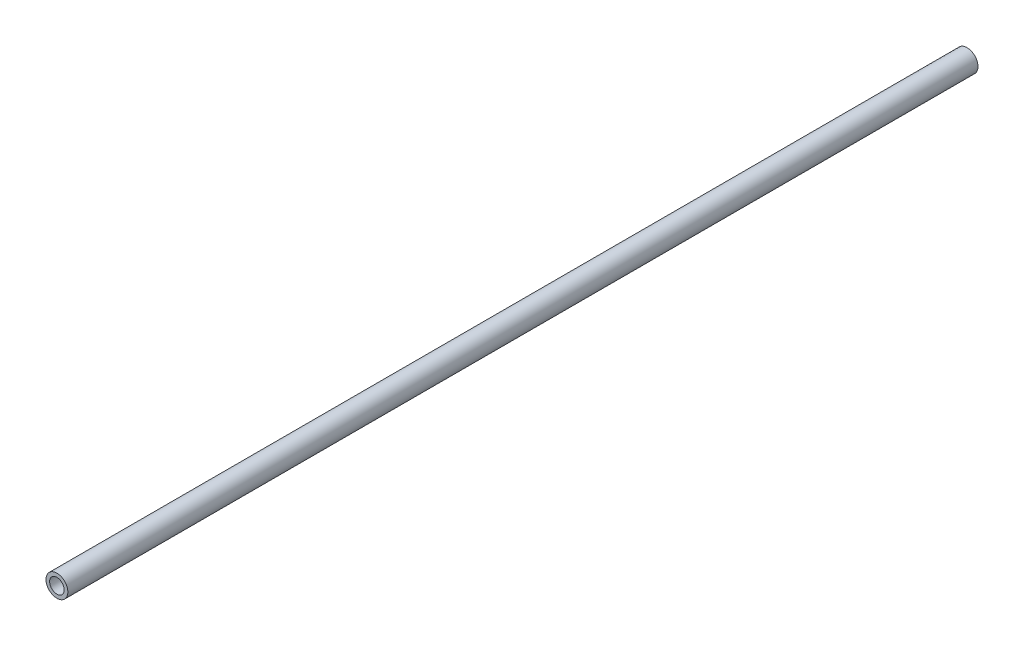
ISO-10303-21;
HEADER;
FILE_DESCRIPTION(('STEP AP214'),'2;1');
FILE_NAME('part.step','',(''),(''),'','','');
FILE_SCHEMA(('AUTOMOTIVE_DESIGN { 1 0 10303 214 1 1 1 1 }'));
ENDSEC;
DATA;
#1=APPLICATION_CONTEXT('core data for automotive mechanical design processes');
#2=APPLICATION_PROTOCOL_DEFINITION('international standard','automotive_design',2000,#1);
#3=PRODUCT_CONTEXT('',#1,'mechanical');
#4=PRODUCT('Part','Part','',(#3));
#5=PRODUCT_RELATED_PRODUCT_CATEGORY('part','',(#4));
#6=PRODUCT_DEFINITION_FORMATION('','',#4);
#7=PRODUCT_DEFINITION_CONTEXT('part definition',#1,'design');
#8=PRODUCT_DEFINITION('design','',#6,#7);
#9=PRODUCT_DEFINITION_SHAPE('','',#8);
#10=(LENGTH_UNIT() NAMED_UNIT(*) SI_UNIT(.MILLI.,.METRE.));
#11=(NAMED_UNIT(*) PLANE_ANGLE_UNIT() SI_UNIT($,.RADIAN.));
#12=(NAMED_UNIT(*) SI_UNIT($,.STERADIAN.) SOLID_ANGLE_UNIT());
#13=UNCERTAINTY_MEASURE_WITH_UNIT(LENGTH_MEASURE(1.E-05),#10,'distance_accuracy_value','');
#14=(GEOMETRIC_REPRESENTATION_CONTEXT(3) GLOBAL_UNCERTAINTY_ASSIGNED_CONTEXT((#13)) GLOBAL_UNIT_ASSIGNED_CONTEXT((#10,
#11,#12)) REPRESENTATION_CONTEXT('',''));
#15=CARTESIAN_POINT('',(0.,0.,0.));
#16=DIRECTION('',(0.,0.,1.));
#17=DIRECTION('',(1.,0.,0.));
#18=AXIS2_PLACEMENT_3D('',#15,#16,#17);
#19=CARTESIAN_POINT('',(0.,0.,250.));
#20=DIRECTION('',(0.,0.,1.));
#21=DIRECTION('',(1.,0.,0.));
#22=AXIS2_PLACEMENT_3D('',#19,#20,#21);
#23=PLANE('',#22);
#24=CARTESIAN_POINT('',(0.,0.,250.));
#25=DIRECTION('',(0.,0.,1.));
#26=DIRECTION('',(1.,0.,0.));
#27=AXIS2_PLACEMENT_3D('',#24,#25,#26);
#28=CIRCLE('',#27,6.);
#29=CARTESIAN_POINT('',(6.,0.,250.));
#30=VERTEX_POINT('',#29);
#31=EDGE_CURVE('E11',#30,#30,#28,.T.);
#32=ORIENTED_EDGE('',*,*,#31,.T.);
#33=EDGE_LOOP('',(#32));
#34=FACE_BOUND('',#33,.T.);
#35=CARTESIAN_POINT('',(0.,0.,250.));
#36=DIRECTION('',(0.,0.,1.));
#37=DIRECTION('',(1.,0.,0.));
#38=AXIS2_PLACEMENT_3D('',#35,#36,#37);
#39=CIRCLE('',#38,4.);
#40=CARTESIAN_POINT('',(4.,0.,250.));
#41=VERTEX_POINT('',#40);
#42=EDGE_CURVE('E47',#41,#41,#39,.T.);
#43=ORIENTED_EDGE('',*,*,#42,.F.);
#44=EDGE_LOOP('',(#43));
#45=FACE_BOUND('',#44,.T.);
#46=ADVANCED_FACE('F36',(#34,#45),#23,.T.);
#47=CARTESIAN_POINT('',(0.,0.,-250.));
#48=DIRECTION('',(0.,0.,1.));
#49=DIRECTION('',(1.,0.,0.));
#50=AXIS2_PLACEMENT_3D('',#47,#48,#49);
#51=PLANE('',#50);
#52=CARTESIAN_POINT('',(0.,0.,-250.));
#53=DIRECTION('',(0.,0.,1.));
#54=DIRECTION('',(1.,0.,0.));
#55=AXIS2_PLACEMENT_3D('',#52,#53,#54);
#56=CIRCLE('',#55,6.);
#57=CARTESIAN_POINT('',(6.,0.,-250.));
#58=VERTEX_POINT('',#57);
#59=EDGE_CURVE('E40',#58,#58,#56,.T.);
#60=ORIENTED_EDGE('',*,*,#59,.F.);
#61=EDGE_LOOP('',(#60));
#62=FACE_BOUND('',#61,.T.);
#63=CARTESIAN_POINT('',(0.,0.,-250.));
#64=DIRECTION('',(0.,0.,1.));
#65=DIRECTION('',(1.,0.,0.));
#66=AXIS2_PLACEMENT_3D('',#63,#64,#65);
#67=CIRCLE('',#66,4.);
#68=CARTESIAN_POINT('',(4.,0.,-250.));
#69=VERTEX_POINT('',#68);
#70=EDGE_CURVE('E49',#69,#69,#67,.T.);
#71=ORIENTED_EDGE('',*,*,#70,.T.);
#72=EDGE_LOOP('',(#71));
#73=FACE_BOUND('',#72,.T.);
#74=ADVANCED_FACE('F59',(#62,#73),#51,.F.);
#75=CARTESIAN_POINT('',(0.,0.,250.));
#76=DIRECTION('',(0.,0.,-1.));
#77=DIRECTION('',(-1.,0.,0.));
#78=AXIS2_PLACEMENT_3D('',#75,#76,#77);
#79=CYLINDRICAL_SURFACE('',#78,6.);
#80=ORIENTED_EDGE('',*,*,#31,.F.);
#81=EDGE_LOOP('',(#80));
#82=FACE_BOUND('',#81,.T.);
#83=ORIENTED_EDGE('',*,*,#59,.T.);
#84=EDGE_LOOP('',(#83));
#85=FACE_BOUND('',#84,.T.);
#86=ADVANCED_FACE('F38',(#82,#85),#79,.T.);
#87=CARTESIAN_POINT('',(0.,0.,250.));
#88=DIRECTION('',(0.,0.,-1.));
#89=DIRECTION('',(-1.,0.,0.));
#90=AXIS2_PLACEMENT_3D('',#87,#88,#89);
#91=CYLINDRICAL_SURFACE('',#90,4.);
#92=ORIENTED_EDGE('',*,*,#42,.T.);
#93=EDGE_LOOP('',(#92));
#94=FACE_BOUND('',#93,.T.);
#95=ORIENTED_EDGE('',*,*,#70,.F.);
#96=EDGE_LOOP('',(#95));
#97=FACE_BOUND('',#96,.T.);
#98=ADVANCED_FACE('F55',(#94,#97),#91,.F.);
#99=CLOSED_SHELL('',(#46,#74,#86,#98));
#100=MANIFOLD_SOLID_BREP('B2',#99);
#101=ADVANCED_BREP_SHAPE_REPRESENTATION('',(#18,#100),#14);
#102=SHAPE_DEFINITION_REPRESENTATION(#9,#101);
ENDSEC;
END-ISO-10303-21;
